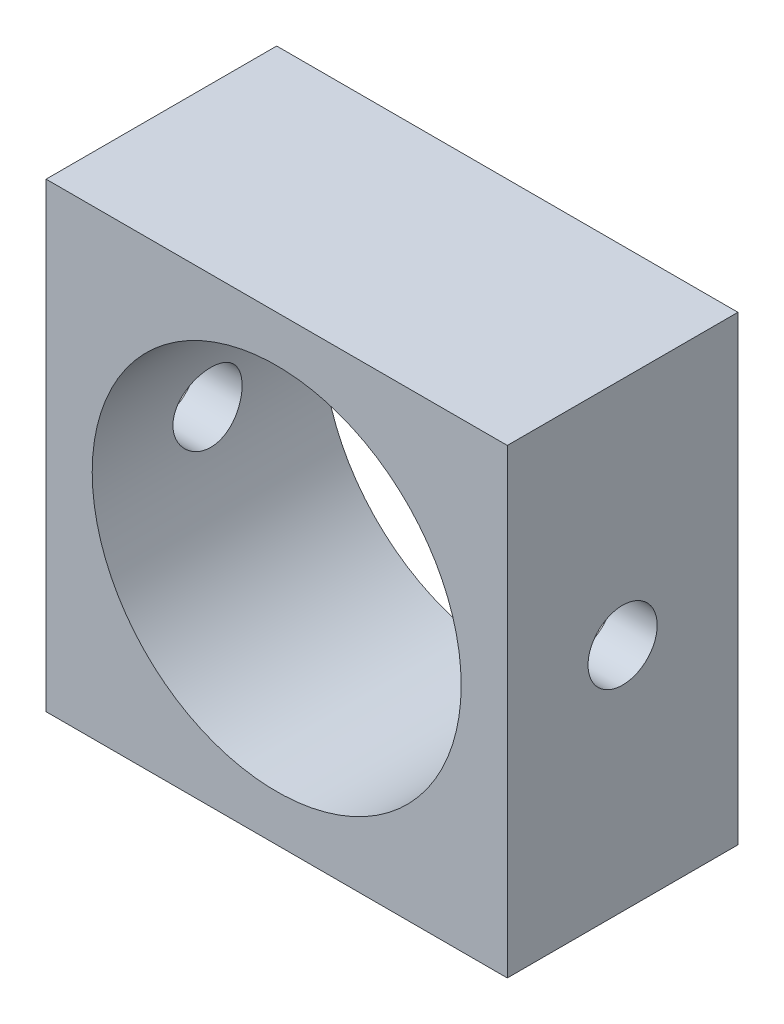
ISO-10303-21;
HEADER;
FILE_DESCRIPTION(('STEP AP214'),'2;1');
FILE_NAME('part.step','',(''),(''),'','','');
FILE_SCHEMA(('AUTOMOTIVE_DESIGN { 1 0 10303 214 1 1 1 1 }'));
ENDSEC;
DATA;
#1=APPLICATION_CONTEXT('core data for automotive mechanical design processes');
#2=APPLICATION_PROTOCOL_DEFINITION('international standard','automotive_design',2000,#1);
#3=PRODUCT_CONTEXT('',#1,'mechanical');
#4=PRODUCT('Part','Part','',(#3));
#5=PRODUCT_RELATED_PRODUCT_CATEGORY('part','',(#4));
#6=PRODUCT_DEFINITION_FORMATION('','',#4);
#7=PRODUCT_DEFINITION_CONTEXT('part definition',#1,'design');
#8=PRODUCT_DEFINITION('design','',#6,#7);
#9=PRODUCT_DEFINITION_SHAPE('','',#8);
#10=(LENGTH_UNIT() NAMED_UNIT(*) SI_UNIT(.MILLI.,.METRE.));
#11=(NAMED_UNIT(*) PLANE_ANGLE_UNIT() SI_UNIT($,.RADIAN.));
#12=(NAMED_UNIT(*) SI_UNIT($,.STERADIAN.) SOLID_ANGLE_UNIT());
#13=UNCERTAINTY_MEASURE_WITH_UNIT(LENGTH_MEASURE(1.E-05),#10,'distance_accuracy_value','');
#14=(GEOMETRIC_REPRESENTATION_CONTEXT(3) GLOBAL_UNCERTAINTY_ASSIGNED_CONTEXT((#13)) GLOBAL_UNIT_ASSIGNED_CONTEXT((#10,
#11,#12)) REPRESENTATION_CONTEXT('',''));
#15=CARTESIAN_POINT('',(0.,0.,0.));
#16=DIRECTION('',(0.,0.,1.));
#17=DIRECTION('',(1.,0.,0.));
#18=AXIS2_PLACEMENT_3D('',#15,#16,#17);
#19=CARTESIAN_POINT('',(0.,0.,10.));
#20=DIRECTION('',(0.,0.,-1.));
#21=DIRECTION('',(-1.,0.,0.));
#22=AXIS2_PLACEMENT_3D('',#19,#20,#21);
#23=PLANE('',#22);
#24=DIRECTION('',(0.,1.,0.));
#25=VECTOR('',#24,1.);
#26=CARTESIAN_POINT('',(10.,-10.,10.));
#27=LINE('',#26,#25);
#28=CARTESIAN_POINT('',(10.,-10.,10.));
#29=VERTEX_POINT('',#28);
#30=CARTESIAN_POINT('',(10.,10.,10.));
#31=VERTEX_POINT('',#30);
#32=EDGE_CURVE('E92',#29,#31,#27,.T.);
#33=ORIENTED_EDGE('',*,*,#32,.T.);
#34=DIRECTION('',(-1.,0.,0.));
#35=VECTOR('',#34,1.);
#36=CARTESIAN_POINT('',(-10.,10.,10.));
#37=LINE('',#36,#35);
#38=CARTESIAN_POINT('',(-10.,10.,10.));
#39=VERTEX_POINT('',#38);
#40=EDGE_CURVE('E87',#31,#39,#37,.T.);
#41=ORIENTED_EDGE('',*,*,#40,.T.);
#42=DIRECTION('',(0.,-1.,0.));
#43=VECTOR('',#42,1.);
#44=CARTESIAN_POINT('',(-10.,-10.,10.));
#45=LINE('',#44,#43);
#46=CARTESIAN_POINT('',(-10.,-10.,10.));
#47=VERTEX_POINT('',#46);
#48=EDGE_CURVE('E90',#39,#47,#45,.T.);
#49=ORIENTED_EDGE('',*,*,#48,.T.);
#50=DIRECTION('',(1.,0.,0.));
#51=VECTOR('',#50,1.);
#52=CARTESIAN_POINT('',(-10.,-10.,10.));
#53=LINE('',#52,#51);
#54=EDGE_CURVE('E57',#47,#29,#53,.T.);
#55=ORIENTED_EDGE('',*,*,#54,.T.);
#56=EDGE_LOOP('',(#33,#41,#49,#55));
#57=FACE_BOUND('',#56,.T.);
#58=CARTESIAN_POINT('',(0.,0.,10.));
#59=DIRECTION('',(0.,0.,1.));
#60=DIRECTION('',(1.,0.,0.));
#61=AXIS2_PLACEMENT_3D('',#58,#59,#60);
#62=CIRCLE('',#61,8.);
#63=CARTESIAN_POINT('',(8.,0.,10.));
#64=VERTEX_POINT('',#63);
#65=EDGE_CURVE('E108',#64,#64,#62,.T.);
#66=ORIENTED_EDGE('',*,*,#65,.F.);
#67=EDGE_LOOP('',(#66));
#68=FACE_BOUND('',#67,.T.);
#69=ADVANCED_FACE('F33',(#57,#68),#23,.F.);
#70=CARTESIAN_POINT('',(0.,0.,0.));
#71=DIRECTION('',(0.,0.,-1.));
#72=DIRECTION('',(-1.,0.,0.));
#73=AXIS2_PLACEMENT_3D('',#70,#71,#72);
#74=PLANE('',#73);
#75=DIRECTION('',(0.,1.,0.));
#76=VECTOR('',#75,1.);
#77=CARTESIAN_POINT('',(10.,-10.,0.));
#78=LINE('',#77,#76);
#79=CARTESIAN_POINT('',(10.,-10.,0.));
#80=VERTEX_POINT('',#79);
#81=CARTESIAN_POINT('',(10.,10.,0.));
#82=VERTEX_POINT('',#81);
#83=EDGE_CURVE('E105',#80,#82,#78,.T.);
#84=ORIENTED_EDGE('',*,*,#83,.F.);
#85=DIRECTION('',(1.,0.,0.));
#86=VECTOR('',#85,1.);
#87=CARTESIAN_POINT('',(-10.,-10.,0.));
#88=LINE('',#87,#86);
#89=CARTESIAN_POINT('',(-10.,-10.,0.));
#90=VERTEX_POINT('',#89);
#91=EDGE_CURVE('E80',#90,#80,#88,.T.);
#92=ORIENTED_EDGE('',*,*,#91,.F.);
#93=DIRECTION('',(0.,-1.,0.));
#94=VECTOR('',#93,1.);
#95=CARTESIAN_POINT('',(-10.,-10.,0.));
#96=LINE('',#95,#94);
#97=CARTESIAN_POINT('',(-10.,10.,0.));
#98=VERTEX_POINT('',#97);
#99=EDGE_CURVE('E74',#98,#90,#96,.T.);
#100=ORIENTED_EDGE('',*,*,#99,.F.);
#101=DIRECTION('',(-1.,0.,0.));
#102=VECTOR('',#101,1.);
#103=CARTESIAN_POINT('',(-10.,10.,0.));
#104=LINE('',#103,#102);
#105=EDGE_CURVE('E96',#82,#98,#104,.T.);
#106=ORIENTED_EDGE('',*,*,#105,.F.);
#107=EDGE_LOOP('',(#84,#92,#100,#106));
#108=FACE_BOUND('',#107,.T.);
#109=CARTESIAN_POINT('',(0.,0.,0.));
#110=DIRECTION('',(0.,0.,1.));
#111=DIRECTION('',(1.,0.,0.));
#112=AXIS2_PLACEMENT_3D('',#109,#110,#111);
#113=CIRCLE('',#112,8.);
#114=CARTESIAN_POINT('',(8.,0.,0.));
#115=VERTEX_POINT('',#114);
#116=EDGE_CURVE('E163',#115,#115,#113,.T.);
#117=ORIENTED_EDGE('',*,*,#116,.T.);
#118=EDGE_LOOP('',(#117));
#119=FACE_BOUND('',#118,.T.);
#120=ADVANCED_FACE('F137',(#108,#119),#74,.T.);
#121=CARTESIAN_POINT('',(10.,-10.,10.));
#122=DIRECTION('',(-1.,0.,0.));
#123=DIRECTION('',(0.,0.,1.));
#124=AXIS2_PLACEMENT_3D('',#121,#122,#123);
#125=PLANE('',#124);
#126=CARTESIAN_POINT('',(10.,0.,5.));
#127=DIRECTION('',(1.,0.,0.));
#128=DIRECTION('',(0.,0.,-1.));
#129=AXIS2_PLACEMENT_3D('',#126,#127,#128);
#130=CIRCLE('',#129,1.5);
#131=CARTESIAN_POINT('',(10.,0.,3.5));
#132=VERTEX_POINT('',#131);
#133=EDGE_CURVE('E158',#132,#132,#130,.T.);
#134=ORIENTED_EDGE('',*,*,#133,.F.);
#135=EDGE_LOOP('',(#134));
#136=FACE_BOUND('',#135,.T.);
#137=ORIENTED_EDGE('',*,*,#83,.T.);
#138=DIRECTION('',(0.,0.,-1.));
#139=VECTOR('',#138,1.);
#140=CARTESIAN_POINT('',(10.,10.,10.));
#141=LINE('',#140,#139);
#142=EDGE_CURVE('E11',#31,#82,#141,.T.);
#143=ORIENTED_EDGE('',*,*,#142,.F.);
#144=ORIENTED_EDGE('',*,*,#32,.F.);
#145=DIRECTION('',(0.,0.,-1.));
#146=VECTOR('',#145,1.);
#147=CARTESIAN_POINT('',(10.,-10.,10.));
#148=LINE('',#147,#146);
#149=EDGE_CURVE('E101',#29,#80,#148,.T.);
#150=ORIENTED_EDGE('',*,*,#149,.T.);
#151=EDGE_LOOP('',(#137,#143,#144,#150));
#152=FACE_BOUND('',#151,.T.);
#153=ADVANCED_FACE('F35',(#136,#152),#125,.F.);
#154=CARTESIAN_POINT('',(-10.,10.,10.));
#155=DIRECTION('',(0.,-1.,0.));
#156=DIRECTION('',(0.,0.,-1.));
#157=AXIS2_PLACEMENT_3D('',#154,#155,#156);
#158=PLANE('',#157);
#159=ORIENTED_EDGE('',*,*,#105,.T.);
#160=DIRECTION('',(0.,0.,-1.));
#161=VECTOR('',#160,1.);
#162=CARTESIAN_POINT('',(-10.,10.,10.));
#163=LINE('',#162,#161);
#164=EDGE_CURVE('E48',#39,#98,#163,.T.);
#165=ORIENTED_EDGE('',*,*,#164,.F.);
#166=ORIENTED_EDGE('',*,*,#40,.F.);
#167=ORIENTED_EDGE('',*,*,#142,.T.);
#168=EDGE_LOOP('',(#159,#165,#166,#167));
#169=FACE_BOUND('',#168,.T.);
#170=ADVANCED_FACE('F95',(#169),#158,.F.);
#171=CARTESIAN_POINT('',(-10.,-10.,10.));
#172=DIRECTION('',(1.,0.,0.));
#173=DIRECTION('',(0.,0.,-1.));
#174=AXIS2_PLACEMENT_3D('',#171,#172,#173);
#175=PLANE('',#174);
#176=CARTESIAN_POINT('',(-10.,0.,5.));
#177=DIRECTION('',(1.,0.,0.));
#178=DIRECTION('',(0.,0.,-1.));
#179=AXIS2_PLACEMENT_3D('',#176,#177,#178);
#180=CIRCLE('',#179,1.5);
#181=CARTESIAN_POINT('',(-10.,0.,3.5));
#182=VERTEX_POINT('',#181);
#183=EDGE_CURVE('E118',#182,#182,#180,.T.);
#184=ORIENTED_EDGE('',*,*,#183,.T.);
#185=EDGE_LOOP('',(#184));
#186=FACE_BOUND('',#185,.T.);
#187=ORIENTED_EDGE('',*,*,#99,.T.);
#188=DIRECTION('',(0.,0.,-1.));
#189=VECTOR('',#188,1.);
#190=CARTESIAN_POINT('',(-10.,-10.,10.));
#191=LINE('',#190,#189);
#192=EDGE_CURVE('E97',#47,#90,#191,.T.);
#193=ORIENTED_EDGE('',*,*,#192,.F.);
#194=ORIENTED_EDGE('',*,*,#48,.F.);
#195=ORIENTED_EDGE('',*,*,#164,.T.);
#196=EDGE_LOOP('',(#187,#193,#194,#195));
#197=FACE_BOUND('',#196,.T.);
#198=ADVANCED_FACE('F99',(#186,#197),#175,.F.);
#199=CARTESIAN_POINT('',(-10.,-10.,10.));
#200=DIRECTION('',(0.,1.,0.));
#201=DIRECTION('',(0.,0.,1.));
#202=AXIS2_PLACEMENT_3D('',#199,#200,#201);
#203=PLANE('',#202);
#204=ORIENTED_EDGE('',*,*,#91,.T.);
#205=ORIENTED_EDGE('',*,*,#149,.F.);
#206=ORIENTED_EDGE('',*,*,#54,.F.);
#207=ORIENTED_EDGE('',*,*,#192,.T.);
#208=EDGE_LOOP('',(#204,#205,#206,#207));
#209=FACE_BOUND('',#208,.T.);
#210=ADVANCED_FACE('F133',(#209),#203,.F.);
#211=CARTESIAN_POINT('',(0.,0.,10.));
#212=DIRECTION('',(0.,0.,-1.));
#213=DIRECTION('',(-1.,0.,0.));
#214=AXIS2_PLACEMENT_3D('',#211,#212,#213);
#215=CYLINDRICAL_SURFACE('',#214,8.);
#216=CARTESIAN_POINT('',(-8.,0.,6.5));
#217=CARTESIAN_POINT('',(-7.99999848833852,-0.0834717464654708,6.49999681041172));
#218=CARTESIAN_POINT('',(-7.99868009921714,-0.166984992730098,6.49300892338062));
#219=CARTESIAN_POINT('',(-7.9935478589052,-0.331658129841797,6.46526000488165));
#220=CARTESIAN_POINT('',(-7.98973190166897,-0.412815974152225,6.44448734936027));
#221=CARTESIAN_POINT('',(-7.98003138765458,-0.570372961851801,6.38982729874066));
#222=CARTESIAN_POINT('',(-7.97414869946483,-0.646776330685344,6.35595174754746));
#223=CARTESIAN_POINT('',(-7.96095710599783,-0.792807973094006,6.27608112307718));
#224=CARTESIAN_POINT('',(-7.9536483161829,-0.862436794477322,6.23008703085518));
#225=CARTESIAN_POINT('',(-7.93831336430504,-0.993783715930502,6.12670023199632));
#226=CARTESIAN_POINT('',(-7.93028034856351,-1.05540895503183,6.06919055532986));
#227=CARTESIAN_POINT('',(-7.9144531845865,-1.16819606135369,5.94465669091244));
#228=CARTESIAN_POINT('',(-7.90665905354527,-1.21935717689241,5.87763182023071));
#229=CARTESIAN_POINT('',(-7.89212551245005,-1.31014998665793,5.73531391163603));
#230=CARTESIAN_POINT('',(-7.88539493886182,-1.34968721969605,5.65995962968276));
#231=CARTESIAN_POINT('',(-7.87384713211987,-1.41550524332283,5.50353108482321));
#232=CARTESIAN_POINT('',(-7.86902973396962,-1.44178717713098,5.42245731588878));
#233=CARTESIAN_POINT('',(-7.8619226957455,-1.480050535035,5.25788476908559));
#234=CARTESIAN_POINT('',(-7.85960445366405,-1.49219390192039,5.17442490279653));
#235=CARTESIAN_POINT('',(-7.85767197152761,-1.50233808095346,5.00662261519175));
#236=CARTESIAN_POINT('',(-7.8580574889876,-1.50034016135374,4.9222802736977));
#237=CARTESIAN_POINT('',(-7.86146292701753,-1.48238979602362,4.75628047473395));
#238=CARTESIAN_POINT('',(-7.86444808147334,-1.46662149996045,4.67460228569984));
#239=CARTESIAN_POINT('',(-7.87266183284666,-1.42186799396207,4.51507158021739));
#240=CARTESIAN_POINT('',(-7.87789052509516,-1.39288222239499,4.4372192264907));
#241=CARTESIAN_POINT('',(-7.89003855292589,-1.322336471793,4.28701132099973));
#242=CARTESIAN_POINT('',(-7.89696783823366,-1.28070213532456,4.21469152941919));
#243=CARTESIAN_POINT('',(-7.91172971602918,-1.18609368930416,4.07799527145977));
#244=CARTESIAN_POINT('',(-7.91956240015522,-1.13311842889266,4.0136196122852));
#245=CARTESIAN_POINT('',(-7.93540001272164,-1.01633905685297,3.89357504432754));
#246=CARTESIAN_POINT('',(-7.94340571024031,-0.952377436860679,3.83805934754826));
#247=CARTESIAN_POINT('',(-7.95857386108318,-0.815968037098822,3.73852275932459));
#248=CARTESIAN_POINT('',(-7.96573630595245,-0.743520172255765,3.69450198312958));
#249=CARTESIAN_POINT('',(-7.97842539677509,-0.592034988874665,3.61918224612998));
#250=CARTESIAN_POINT('',(-7.98394999136289,-0.51298956444649,3.5878992208821));
#251=CARTESIAN_POINT('',(-7.99272505402719,-0.350639115398693,3.53909790690784));
#252=CARTESIAN_POINT('',(-7.99597576367994,-0.267334544277784,3.52157815595464));
#253=CARTESIAN_POINT('',(-7.99980360641981,-0.100148652903381,3.50101396898173));
#254=CARTESIAN_POINT('',(-8.00041950912279,-0.0162940126341314,3.49775960847027));
#255=CARTESIAN_POINT('',(-7.99901543598228,0.150761248092188,3.50525547954765));
#256=CARTESIAN_POINT('',(-7.99699558964431,0.233961900480389,3.51600502306526));
#257=CARTESIAN_POINT('',(-7.99057111500406,0.39668157321822,3.55102903518337));
#258=CARTESIAN_POINT('',(-7.98618522374031,0.476224261046066,3.57519728253781));
#259=CARTESIAN_POINT('',(-7.97551842212498,0.630128631824636,3.63625770677879));
#260=CARTESIAN_POINT('',(-7.96923738311334,0.704489962595106,3.67315074756579));
#261=CARTESIAN_POINT('',(-7.95538030357666,0.846816671513217,3.75907812815951));
#262=CARTESIAN_POINT('',(-7.94779086174563,0.914703277015124,3.80824073853684));
#263=CARTESIAN_POINT('',(-7.93219343489711,1.04133832326455,3.91713813736236));
#264=CARTESIAN_POINT('',(-7.92418541084687,1.10008590976087,3.97687391300133));
#265=CARTESIAN_POINT('',(-7.9085247569745,1.20757295872048,4.10617231891143));
#266=CARTESIAN_POINT('',(-7.90087825860257,1.25616916218577,4.17585490812539));
#267=CARTESIAN_POINT('',(-7.88692985578532,1.34096675057787,4.32251762452375));
#268=CARTESIAN_POINT('',(-7.8806279013735,1.37716859613924,4.39949748037047));
#269=CARTESIAN_POINT('',(-7.87013024209574,1.43594673512823,4.55820586724254));
#270=CARTESIAN_POINT('',(-7.86592440436878,1.45858868794786,4.63990937955933));
#271=CARTESIAN_POINT('',(-7.86007203802415,1.48980679326236,4.8060472225214));
#272=CARTESIAN_POINT('',(-7.8584252206579,1.49838453270708,4.8904812439704));
#273=CARTESIAN_POINT('',(-7.85789199803857,1.50117762148355,5.05824833144151));
#274=CARTESIAN_POINT('',(-7.85896215974293,1.49561895003499,5.141577580957));
#275=CARTESIAN_POINT('',(-7.86364600659998,1.47079175378803,5.30609142204529));
#276=CARTESIAN_POINT('',(-7.86725967655747,1.45152331089332,5.38727602642744));
#277=CARTESIAN_POINT('',(-7.8766050802318,1.39991887583263,5.54507448479548));
#278=CARTESIAN_POINT('',(-7.88233284594965,1.36760735397252,5.62169659134577));
#279=CARTESIAN_POINT('',(-7.8952638755184,1.29085868912204,5.76846825424085));
#280=CARTESIAN_POINT('',(-7.90246724360119,1.24642068948186,5.83861735284478));
#281=CARTESIAN_POINT('',(-7.91767266107745,1.14589487339535,5.9715836800423));
#282=CARTESIAN_POINT('',(-7.92568505353043,1.08964259864304,6.0342754125671));
#283=CARTESIAN_POINT('',(-7.94152833918735,0.967427926742291,6.14940516246452));
#284=CARTESIAN_POINT('',(-7.94935919027328,0.901463301891616,6.20184082098014));
#285=CARTESIAN_POINT('',(-7.96403975968049,0.760984945071873,6.29541095262706));
#286=CARTESIAN_POINT('',(-7.97088000990561,0.686399590640516,6.33643942849064));
#287=CARTESIAN_POINT('',(-7.98271619380687,0.531290113653833,6.40531763660514));
#288=CARTESIAN_POINT('',(-7.98771385879037,0.450771651705248,6.43317974704691));
#289=CARTESIAN_POINT('',(-7.99428290707632,0.308347202825154,6.46927731441868));
#290=CARTESIAN_POINT('',(-7.99641470878206,0.24727381025187,6.4807786303128));
#291=CARTESIAN_POINT('',(-7.9992737995401,0.124141247115157,6.49614106211645));
#292=CARTESIAN_POINT('',(-8.00000112429805,0.0620821016527092,6.50000237225591));
#293=CARTESIAN_POINT('',(-8.,0.,6.5));
#294=B_SPLINE_CURVE_WITH_KNOTS('',3,(#216,#217,#218,#219,#220,#221,#222,#223,#224,#225,#226,
#227,#228,#229,#230,#231,#232,#233,#234,#235,#236,#237,#238,#239,#240,#241,#242,#243,#244,#245,
#246,#247,#248,#249,#250,#251,#252,#253,#254,#255,#256,#257,#258,#259,#260,#261,#262,#263,#264,
#265,#266,#267,#268,#269,#270,#271,#272,#273,#274,#275,#276,#277,#278,#279,#280,#281,#282,#283,
#284,#285,#286,#287,#288,#289,#290,#291,#292,#293),.UNSPECIFIED.,.T.,.F.,(4,2,2,2,2,2,2,2,2,2,2,
2,2,2,2,2,2,2,2,2,2,2,2,2,2,2,2,2,2,2,2,2,2,2,2,2,2,2,4),(0.,0.250188200964924,
0.500587642535452,0.750761271230907,1.00091465336891,1.25375118013631,1.50660586283617,
1.76146190504357,2.01629596311948,2.26818151445336,2.52004447587256,2.76859000612765,
3.01714609846786,3.26719262629531,3.51726454049859,3.77127768464077,4.02529337544948,
4.27962588321699,4.53393136673745,4.78448174076097,5.03501980464583,5.28360233907828,
5.53220175338032,5.78351778017708,6.03485728413098,6.28953436987299,6.54420198954945,
6.79762627818559,7.05102196946513,7.30039252231748,7.54976158541507,7.79866496207692,
8.04758592655423,8.3002336996638,8.55293951262255,8.80792048916314,9.06266126931173,
9.24874344524409,9.4348208903954),.UNSPECIFIED.);
#295=CARTESIAN_POINT('',(-8.,0.,6.5));
#296=VERTEX_POINT('',#295);
#297=EDGE_CURVE('E37',#296,#296,#294,.T.);
#298=ORIENTED_EDGE('',*,*,#297,.F.);
#299=EDGE_LOOP('',(#298));
#300=FACE_BOUND('',#299,.T.);
#301=CARTESIAN_POINT('',(8.,0.,3.5));
#302=CARTESIAN_POINT('',(7.99999848833852,-0.083471746465469,3.50000318958828));
#303=CARTESIAN_POINT('',(7.99868009921714,-0.166984992730097,3.50699107661938));
#304=CARTESIAN_POINT('',(7.9935478589052,-0.331658129841796,3.53473999511835));
#305=CARTESIAN_POINT('',(7.98973190166897,-0.412815974152224,3.55551265063973));
#306=CARTESIAN_POINT('',(7.98003138765458,-0.570372961851799,3.61017270125934));
#307=CARTESIAN_POINT('',(7.97414869946483,-0.646776330685342,3.64404825245254));
#308=CARTESIAN_POINT('',(7.96095710599783,-0.792807973094005,3.72391887692282));
#309=CARTESIAN_POINT('',(7.9536483161829,-0.862436794477321,3.76991296914482));
#310=CARTESIAN_POINT('',(7.93831336430504,-0.993783715930501,3.87329976800368));
#311=CARTESIAN_POINT('',(7.93028034856351,-1.05540895503183,3.93080944467014));
#312=CARTESIAN_POINT('',(7.9144531845865,-1.16819606135369,4.05534330908756));
#313=CARTESIAN_POINT('',(7.90665905354528,-1.21935717689241,4.12236817976929));
#314=CARTESIAN_POINT('',(7.89212551245006,-1.31014998665793,4.26468608836397));
#315=CARTESIAN_POINT('',(7.88539493886182,-1.34968721969605,4.34004037031724));
#316=CARTESIAN_POINT('',(7.87384713211987,-1.41550524332283,4.49646891517679));
#317=CARTESIAN_POINT('',(7.86902973396962,-1.44178717713098,4.57754268411122));
#318=CARTESIAN_POINT('',(7.8619226957455,-1.480050535035,4.74211523091441));
#319=CARTESIAN_POINT('',(7.85960445366405,-1.49219390192039,4.82557509720346));
#320=CARTESIAN_POINT('',(7.85767197152761,-1.50233808095346,4.99337738480825));
#321=CARTESIAN_POINT('',(7.8580574889876,-1.50034016135374,5.0777197263023));
#322=CARTESIAN_POINT('',(7.86146292701753,-1.48238979602362,5.24371952526605));
#323=CARTESIAN_POINT('',(7.86444808147334,-1.46662149996045,5.32539771430015));
#324=CARTESIAN_POINT('',(7.87266183284666,-1.42186799396207,5.48492841978261));
#325=CARTESIAN_POINT('',(7.87789052509516,-1.39288222239499,5.5627807735093));
#326=CARTESIAN_POINT('',(7.89003855292589,-1.322336471793,5.71298867900026));
#327=CARTESIAN_POINT('',(7.89696783823366,-1.28070213532456,5.78530847058081));
#328=CARTESIAN_POINT('',(7.91172971602918,-1.18609368930416,5.92200472854023));
#329=CARTESIAN_POINT('',(7.91956240015522,-1.13311842889266,5.9863803877148));
#330=CARTESIAN_POINT('',(7.93540001272164,-1.01633905685298,6.10642495567246));
#331=CARTESIAN_POINT('',(7.94340571024031,-0.952377436860681,6.16194065245174));
#332=CARTESIAN_POINT('',(7.95857386108318,-0.815968037098825,6.2614772406754));
#333=CARTESIAN_POINT('',(7.96573630595245,-0.743520172255768,6.30549801687042));
#334=CARTESIAN_POINT('',(7.97842539677509,-0.592034988874666,6.38081775387002));
#335=CARTESIAN_POINT('',(7.98394999136289,-0.512989564446492,6.4121007791179));
#336=CARTESIAN_POINT('',(7.99272505402719,-0.350639115398695,6.46090209309216));
#337=CARTESIAN_POINT('',(7.99597576367994,-0.267334544277785,6.47842184404536));
#338=CARTESIAN_POINT('',(7.99980360641981,-0.100148652903383,6.49898603101827));
#339=CARTESIAN_POINT('',(8.00041950912279,-0.0162940126341333,6.50224039152973));
#340=CARTESIAN_POINT('',(7.99901543598228,0.150761248092186,6.49474452045235));
#341=CARTESIAN_POINT('',(7.99699558964431,0.233961900480387,6.48399497693474));
#342=CARTESIAN_POINT('',(7.99057111500406,0.396681573218219,6.44897096481663));
#343=CARTESIAN_POINT('',(7.98618522374031,0.476224261046065,6.42480271746219));
#344=CARTESIAN_POINT('',(7.97551842212498,0.630128631824635,6.36374229322121));
#345=CARTESIAN_POINT('',(7.96923738311334,0.704489962595105,6.32684925243422));
#346=CARTESIAN_POINT('',(7.95538030357666,0.846816671513216,6.24092187184049));
#347=CARTESIAN_POINT('',(7.94779086174563,0.914703277015123,6.19175926146316));
#348=CARTESIAN_POINT('',(7.93219343489711,1.04133832326455,6.08286186263764));
#349=CARTESIAN_POINT('',(7.92418541084687,1.10008590976087,6.02312608699867));
#350=CARTESIAN_POINT('',(7.9085247569745,1.20757295872048,5.89382768108857));
#351=CARTESIAN_POINT('',(7.90087825860257,1.25616916218577,5.82414509187461));
#352=CARTESIAN_POINT('',(7.88692985578532,1.34096675057787,5.67748237547625));
#353=CARTESIAN_POINT('',(7.8806279013735,1.37716859613924,5.60050251962953));
#354=CARTESIAN_POINT('',(7.87013024209574,1.43594673512823,5.44179413275746));
#355=CARTESIAN_POINT('',(7.86592440436878,1.45858868794786,5.36009062044067));
#356=CARTESIAN_POINT('',(7.86007203802415,1.48980679326236,5.1939527774786));
#357=CARTESIAN_POINT('',(7.8584252206579,1.49838453270708,5.1095187560296));
#358=CARTESIAN_POINT('',(7.85789199803857,1.50117762148355,4.94175166855849));
#359=CARTESIAN_POINT('',(7.85896215974293,1.49561895003499,4.858422419043));
#360=CARTESIAN_POINT('',(7.86364600659998,1.47079175378803,4.69390857795471));
#361=CARTESIAN_POINT('',(7.86725967655747,1.45152331089332,4.61272397357256));
#362=CARTESIAN_POINT('',(7.8766050802318,1.39991887583263,4.45492551520452));
#363=CARTESIAN_POINT('',(7.88233284594965,1.36760735397253,4.37830340865423));
#364=CARTESIAN_POINT('',(7.8952638755184,1.29085868912204,4.23153174575916));
#365=CARTESIAN_POINT('',(7.90246724360119,1.24642068948186,4.16138264715522));
#366=CARTESIAN_POINT('',(7.91767266107745,1.14589487339535,4.02841631995771));
#367=CARTESIAN_POINT('',(7.92568505353043,1.08964259864304,3.9657245874329));
#368=CARTESIAN_POINT('',(7.94152833918735,0.967427926742291,3.85059483753548));
#369=CARTESIAN_POINT('',(7.94935919027328,0.901463301891616,3.79815917901986));
#370=CARTESIAN_POINT('',(7.96403975968049,0.760984945071874,3.70458904737294));
#371=CARTESIAN_POINT('',(7.97088000990561,0.686399590640517,3.66356057150936));
#372=CARTESIAN_POINT('',(7.98271619380687,0.531290113653834,3.59468236339486));
#373=CARTESIAN_POINT('',(7.98771385879037,0.450771651705249,3.56682025295309));
#374=CARTESIAN_POINT('',(7.99428290707632,0.308347202825155,3.53072268558133));
#375=CARTESIAN_POINT('',(7.99641470878206,0.247273810251872,3.5192213696872));
#376=CARTESIAN_POINT('',(7.9992737995401,0.12414124711516,3.50385893788355));
#377=CARTESIAN_POINT('',(8.00000112429805,0.0620821016527112,3.49999762774409));
#378=CARTESIAN_POINT('',(8.,0.,3.5));
#379=B_SPLINE_CURVE_WITH_KNOTS('',3,(#301,#302,#303,#304,#305,#306,#307,#308,#309,#310,#311,
#312,#313,#314,#315,#316,#317,#318,#319,#320,#321,#322,#323,#324,#325,#326,#327,#328,#329,#330,
#331,#332,#333,#334,#335,#336,#337,#338,#339,#340,#341,#342,#343,#344,#345,#346,#347,#348,#349,
#350,#351,#352,#353,#354,#355,#356,#357,#358,#359,#360,#361,#362,#363,#364,#365,#366,#367,#368,
#369,#370,#371,#372,#373,#374,#375,#376,#377,#378),.UNSPECIFIED.,.T.,.F.,(4,2,2,2,2,2,2,2,2,2,2,
2,2,2,2,2,2,2,2,2,2,2,2,2,2,2,2,2,2,2,2,2,2,2,2,2,2,2,4),(0.,0.250188200964924,
0.500587642535452,0.750761271230907,1.00091465336891,1.2537511801363,1.50660586283617,
1.76146190504357,2.01629596311948,2.26818151445336,2.52004447587256,2.76859000612765,
3.01714609846787,3.26719262629531,3.51726454049859,3.77127768464077,4.02529337544948,
4.27962588321699,4.53393136673745,4.78448174076097,5.03501980464583,5.28360233907828,
5.53220175338032,5.78351778017708,6.03485728413098,6.28953436987299,6.54420198954945,
6.79762627818559,7.05102196946513,7.30039252231748,7.54976158541507,7.79866496207693,
8.04758592655423,8.3002336996638,8.55293951262255,8.80792048916315,9.06266126931173,
9.24874344524409,9.43482089039541),.UNSPECIFIED.);
#380=CARTESIAN_POINT('',(8.,0.,3.5));
#381=VERTEX_POINT('',#380);
#382=EDGE_CURVE('E113',#381,#381,#379,.T.);
#383=ORIENTED_EDGE('',*,*,#382,.F.);
#384=EDGE_LOOP('',(#383));
#385=FACE_BOUND('',#384,.T.);
#386=ORIENTED_EDGE('',*,*,#65,.T.);
#387=EDGE_LOOP('',(#386));
#388=FACE_BOUND('',#387,.T.);
#389=ORIENTED_EDGE('',*,*,#116,.F.);
#390=EDGE_LOOP('',(#389));
#391=FACE_BOUND('',#390,.T.);
#392=ADVANCED_FACE('F119',(#300,#385,#388,#391),#215,.F.);
#393=CARTESIAN_POINT('',(-10.,0.,5.));
#394=DIRECTION('',(1.,0.,0.));
#395=DIRECTION('',(0.,0.,-1.));
#396=AXIS2_PLACEMENT_3D('',#393,#394,#395);
#397=CYLINDRICAL_SURFACE('',#396,1.5);
#398=ORIENTED_EDGE('',*,*,#382,.T.);
#399=EDGE_LOOP('',(#398));
#400=FACE_BOUND('',#399,.T.);
#401=ORIENTED_EDGE('',*,*,#133,.T.);
#402=EDGE_LOOP('',(#401));
#403=FACE_BOUND('',#402,.T.);
#404=ADVANCED_FACE('F122',(#400,#403),#397,.F.);
#405=ORIENTED_EDGE('',*,*,#297,.T.);
#406=EDGE_LOOP('',(#405));
#407=FACE_BOUND('',#406,.T.);
#408=ORIENTED_EDGE('',*,*,#183,.F.);
#409=EDGE_LOOP('',(#408));
#410=FACE_BOUND('',#409,.T.);
#411=ADVANCED_FACE('F125',(#407,#410),#397,.F.);
#412=CLOSED_SHELL('',(#69,#120,#153,#170,#198,#210,#392,#404,#411));
#413=MANIFOLD_SOLID_BREP('B2',#412);
#414=ADVANCED_BREP_SHAPE_REPRESENTATION('',(#18,#413),#14);
#415=SHAPE_DEFINITION_REPRESENTATION(#9,#414);
ENDSEC;
END-ISO-10303-21;
